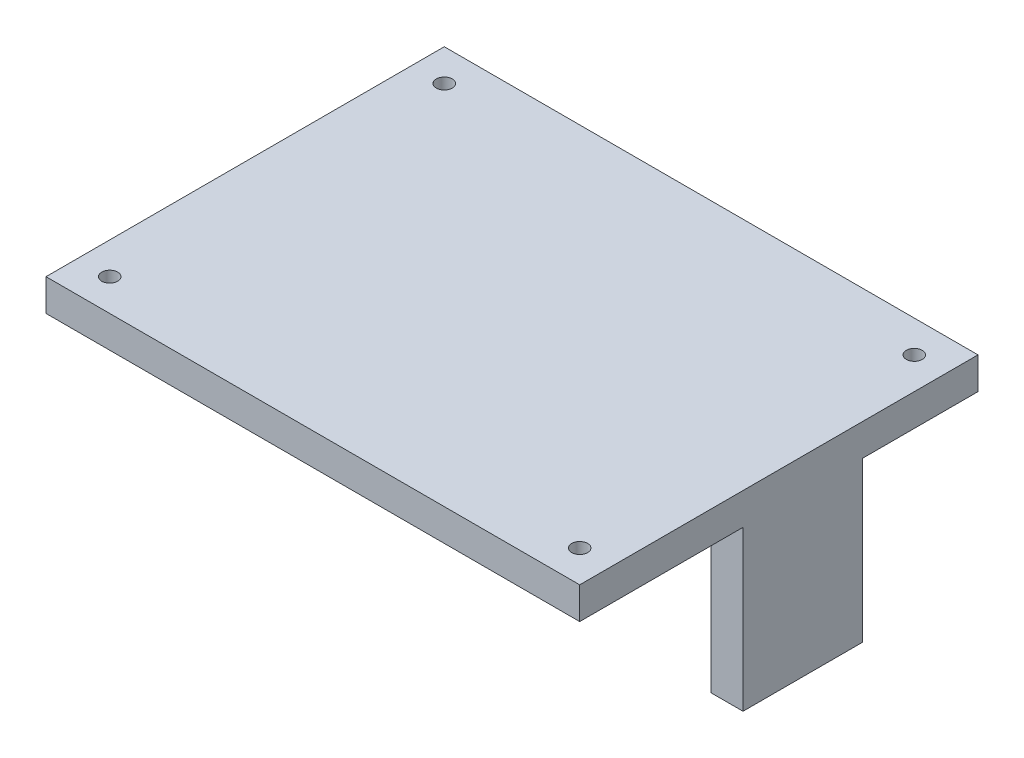
ISO-10303-21;
HEADER;
FILE_DESCRIPTION(('STEP AP214'),'2;1');
FILE_NAME('part.step','',(''),(''),'','','');
FILE_SCHEMA(('AUTOMOTIVE_DESIGN { 1 0 10303 214 1 1 1 1 }'));
ENDSEC;
DATA;
#1=APPLICATION_CONTEXT('core data for automotive mechanical design processes');
#2=APPLICATION_PROTOCOL_DEFINITION('international standard','automotive_design',2000,#1);
#3=PRODUCT_CONTEXT('',#1,'mechanical');
#4=PRODUCT('Part','Part','',(#3));
#5=PRODUCT_RELATED_PRODUCT_CATEGORY('part','',(#4));
#6=PRODUCT_DEFINITION_FORMATION('','',#4);
#7=PRODUCT_DEFINITION_CONTEXT('part definition',#1,'design');
#8=PRODUCT_DEFINITION('design','',#6,#7);
#9=PRODUCT_DEFINITION_SHAPE('','',#8);
#10=(LENGTH_UNIT() NAMED_UNIT(*) SI_UNIT(.MILLI.,.METRE.));
#11=(NAMED_UNIT(*) PLANE_ANGLE_UNIT() SI_UNIT($,.RADIAN.));
#12=(NAMED_UNIT(*) SI_UNIT($,.STERADIAN.) SOLID_ANGLE_UNIT());
#13=UNCERTAINTY_MEASURE_WITH_UNIT(LENGTH_MEASURE(1.E-05),#10,'distance_accuracy_value','');
#14=(GEOMETRIC_REPRESENTATION_CONTEXT(3) GLOBAL_UNCERTAINTY_ASSIGNED_CONTEXT((#13)) GLOBAL_UNIT_ASSIGNED_CONTEXT((#10,
#11,#12)) REPRESENTATION_CONTEXT('',''));
#15=CARTESIAN_POINT('',(0.,0.,0.));
#16=DIRECTION('',(0.,0.,1.));
#17=DIRECTION('',(1.,0.,0.));
#18=AXIS2_PLACEMENT_3D('',#15,#16,#17);
#19=CARTESIAN_POINT('',(0.,9.86878740162637,0.));
#20=DIRECTION('',(0.,1.,0.));
#21=DIRECTION('',(0.,0.,1.));
#22=AXIS2_PLACEMENT_3D('',#19,#20,#21);
#23=PLANE('',#22);
#24=CARTESIAN_POINT('',(9.24437035614937,9.86878740162637,-0.373895207510033));
#25=DIRECTION('',(0.,1.,0.));
#26=DIRECTION('',(0.,0.,1.));
#27=AXIS2_PLACEMENT_3D('',#24,#25,#26);
#28=CIRCLE('',#27,0.500000000000001);
#29=CARTESIAN_POINT('',(9.24437035614937,9.86878740162637,0.126104792489968));
#30=VERTEX_POINT('',#29);
#31=EDGE_CURVE('E147',#30,#30,#28,.F.);
#32=ORIENTED_EDGE('',*,*,#31,.F.);
#33=EDGE_LOOP('',(#32));
#34=FACE_BOUND('',#33,.T.);
#35=CARTESIAN_POINT('',(38.7443703561494,9.86878740162637,-21.37389520751));
#36=DIRECTION('',(0.,1.,0.));
#37=DIRECTION('',(0.,0.,1.));
#38=AXIS2_PLACEMENT_3D('',#35,#36,#37);
#39=CIRCLE('',#38,0.499999999999999);
#40=CARTESIAN_POINT('',(38.7443703561494,9.86878740162637,-20.87389520751));
#41=VERTEX_POINT('',#40);
#42=EDGE_CURVE('E192',#41,#41,#39,.F.);
#43=ORIENTED_EDGE('',*,*,#42,.F.);
#44=EDGE_LOOP('',(#43));
#45=FACE_BOUND('',#44,.T.);
#46=CARTESIAN_POINT('',(38.7443703561494,9.86878740162637,-0.373895207510033));
#47=DIRECTION('',(0.,1.,0.));
#48=DIRECTION('',(0.,0.,1.));
#49=AXIS2_PLACEMENT_3D('',#46,#47,#48);
#50=CIRCLE('',#49,0.499999999999999);
#51=CARTESIAN_POINT('',(38.7443703561494,9.86878740162637,0.126104792489967));
#52=VERTEX_POINT('',#51);
#53=EDGE_CURVE('E188',#52,#52,#50,.F.);
#54=ORIENTED_EDGE('',*,*,#53,.F.);
#55=EDGE_LOOP('',(#54));
#56=FACE_BOUND('',#55,.T.);
#57=CARTESIAN_POINT('',(9.24437035614937,9.86878740162637,-21.37389520751));
#58=DIRECTION('',(0.,1.,0.));
#59=DIRECTION('',(0.,0.,1.));
#60=AXIS2_PLACEMENT_3D('',#57,#58,#59);
#61=CIRCLE('',#60,0.500000000000001);
#62=CARTESIAN_POINT('',(9.24437035614937,9.86878740162637,-20.87389520751));
#63=VERTEX_POINT('',#62);
#64=EDGE_CURVE('E184',#63,#63,#61,.F.);
#65=ORIENTED_EDGE('',*,*,#64,.F.);
#66=EDGE_LOOP('',(#65));
#67=FACE_BOUND('',#66,.T.);
#68=DIRECTION('',(1.,0.,0.));
#69=VECTOR('',#68,1.);
#70=CARTESIAN_POINT('',(40.7443703561494,9.86878740162637,-16.12389520751));
#71=LINE('',#70,#69);
#72=CARTESIAN_POINT('',(38.7443703561494,9.86878740162637,-16.12389520751));
#73=VERTEX_POINT('',#72);
#74=CARTESIAN_POINT('',(40.7443703561494,9.86878740162637,-16.12389520751));
#75=VERTEX_POINT('',#74);
#76=EDGE_CURVE('E59',#73,#75,#71,.T.);
#77=ORIENTED_EDGE('',*,*,#76,.F.);
#78=DIRECTION('',(0.,0.,-1.));
#79=VECTOR('',#78,1.);
#80=CARTESIAN_POINT('',(38.7443703561494,9.86878740162637,-8.62389520751003));
#81=LINE('',#80,#79);
#82=CARTESIAN_POINT('',(38.7443703561494,9.86878740162637,-8.62389520751003));
#83=VERTEX_POINT('',#82);
#84=EDGE_CURVE('E231',#83,#73,#81,.T.);
#85=ORIENTED_EDGE('',*,*,#84,.F.);
#86=DIRECTION('',(-1.,0.,0.));
#87=VECTOR('',#86,1.);
#88=CARTESIAN_POINT('',(40.7443703561494,9.86878740162637,-8.62389520751003));
#89=LINE('',#88,#87);
#90=CARTESIAN_POINT('',(40.7443703561494,9.86878740162637,-8.62389520751003));
#91=VERTEX_POINT('',#90);
#92=EDGE_CURVE('E65',#91,#83,#89,.T.);
#93=ORIENTED_EDGE('',*,*,#92,.F.);
#94=DIRECTION('',(0.,0.,1.));
#95=VECTOR('',#94,1.);
#96=CARTESIAN_POINT('',(40.7443703561494,9.86878740162637,0.));
#97=LINE('',#96,#95);
#98=CARTESIAN_POINT('',(40.7443703561494,9.86878740162637,1.62610479248997));
#99=VERTEX_POINT('',#98);
#100=EDGE_CURVE('E131',#91,#99,#97,.T.);
#101=ORIENTED_EDGE('',*,*,#100,.T.);
#102=DIRECTION('',(1.,0.,0.));
#103=VECTOR('',#102,1.);
#104=CARTESIAN_POINT('',(0.,9.86878740162637,1.62610479248997));
#105=LINE('',#104,#103);
#106=CARTESIAN_POINT('',(7.24437035614937,9.86878740162637,1.62610479248997));
#107=VERTEX_POINT('',#106);
#108=EDGE_CURVE('E180',#107,#99,#105,.T.);
#109=ORIENTED_EDGE('',*,*,#108,.F.);
#110=DIRECTION('',(0.,0.,1.));
#111=VECTOR('',#110,1.);
#112=CARTESIAN_POINT('',(7.24437035614937,9.86878740162637,0.));
#113=LINE('',#112,#111);
#114=CARTESIAN_POINT('',(7.24437035614937,9.86878740162637,-23.37389520751));
#115=VERTEX_POINT('',#114);
#116=EDGE_CURVE('E177',#115,#107,#113,.T.);
#117=ORIENTED_EDGE('',*,*,#116,.F.);
#118=DIRECTION('',(-1.,0.,0.));
#119=VECTOR('',#118,1.);
#120=CARTESIAN_POINT('',(0.,9.86878740162637,-23.37389520751));
#121=LINE('',#120,#119);
#122=CARTESIAN_POINT('',(40.7443703561494,9.86878740162637,-23.37389520751));
#123=VERTEX_POINT('',#122);
#124=EDGE_CURVE('E174',#123,#115,#121,.T.);
#125=ORIENTED_EDGE('',*,*,#124,.F.);
#126=EDGE_CURVE('E136',#123,#75,#97,.T.);
#127=ORIENTED_EDGE('',*,*,#126,.T.);
#128=EDGE_LOOP('',(#77,#85,#93,#101,#109,#117,#125,#127));
#129=FACE_BOUND('',#128,.T.);
#130=ADVANCED_FACE('F43',(#34,#45,#56,#67,#129),#23,.F.);
#131=CARTESIAN_POINT('',(40.7443703561494,11.8687874016264,0.));
#132=DIRECTION('',(1.,0.,0.));
#133=DIRECTION('',(0.,0.,-1.));
#134=AXIS2_PLACEMENT_3D('',#131,#132,#133);
#135=PLANE('',#134);
#136=ORIENTED_EDGE('',*,*,#126,.F.);
#137=DIRECTION('',(0.,-1.,0.));
#138=VECTOR('',#137,1.);
#139=CARTESIAN_POINT('',(40.7443703561494,11.8687874016264,-23.37389520751));
#140=LINE('',#139,#138);
#141=CARTESIAN_POINT('',(40.7443703561494,11.8687874016264,-23.37389520751));
#142=VERTEX_POINT('',#141);
#143=EDGE_CURVE('E11',#142,#123,#140,.T.);
#144=ORIENTED_EDGE('',*,*,#143,.F.);
#145=DIRECTION('',(0.,0.,1.));
#146=VECTOR('',#145,1.);
#147=CARTESIAN_POINT('',(40.7443703561494,11.8687874016264,0.));
#148=LINE('',#147,#146);
#149=CARTESIAN_POINT('',(40.7443703561494,11.8687874016264,1.62610479248997));
#150=VERTEX_POINT('',#149);
#151=EDGE_CURVE('E142',#142,#150,#148,.T.);
#152=ORIENTED_EDGE('',*,*,#151,.T.);
#153=DIRECTION('',(0.,-1.,0.));
#154=VECTOR('',#153,1.);
#155=CARTESIAN_POINT('',(40.7443703561494,11.8687874016264,1.62610479248997));
#156=LINE('',#155,#154);
#157=EDGE_CURVE('E171',#150,#99,#156,.T.);
#158=ORIENTED_EDGE('',*,*,#157,.T.);
#159=ORIENTED_EDGE('',*,*,#100,.F.);
#160=DIRECTION('',(0.,1.,0.));
#161=VECTOR('',#160,1.);
#162=CARTESIAN_POINT('',(40.7443703561494,-0.131212598373632,-8.62389520751003));
#163=LINE('',#162,#161);
#164=CARTESIAN_POINT('',(40.7443703561494,-0.131212598373632,-8.62389520751003));
#165=VERTEX_POINT('',#164);
#166=EDGE_CURVE('E111',#165,#91,#163,.T.);
#167=ORIENTED_EDGE('',*,*,#166,.F.);
#168=DIRECTION('',(0.,0.,1.));
#169=VECTOR('',#168,1.);
#170=CARTESIAN_POINT('',(40.7443703561494,-0.131212598373632,-8.62389520751003));
#171=LINE('',#170,#169);
#172=CARTESIAN_POINT('',(40.7443703561494,-0.131212598373632,-16.12389520751));
#173=VERTEX_POINT('',#172);
#174=EDGE_CURVE('E118',#173,#165,#171,.T.);
#175=ORIENTED_EDGE('',*,*,#174,.F.);
#176=DIRECTION('',(0.,1.,0.));
#177=VECTOR('',#176,1.);
#178=CARTESIAN_POINT('',(40.7443703561494,-0.131212598373632,-16.12389520751));
#179=LINE('',#178,#177);
#180=EDGE_CURVE('E225',#173,#75,#179,.T.);
#181=ORIENTED_EDGE('',*,*,#180,.T.);
#182=EDGE_LOOP('',(#136,#144,#152,#158,#159,#167,#175,#181));
#183=FACE_BOUND('',#182,.T.);
#184=ADVANCED_FACE('F45',(#183),#135,.T.);
#185=CARTESIAN_POINT('',(0.,11.8687874016264,-23.37389520751));
#186=DIRECTION('',(0.,0.,1.));
#187=DIRECTION('',(1.,0.,0.));
#188=AXIS2_PLACEMENT_3D('',#185,#186,#187);
#189=PLANE('',#188);
#190=ORIENTED_EDGE('',*,*,#124,.T.);
#191=DIRECTION('',(0.,-1.,0.));
#192=VECTOR('',#191,1.);
#193=CARTESIAN_POINT('',(7.24437035614937,11.8687874016264,-23.37389520751));
#194=LINE('',#193,#192);
#195=CARTESIAN_POINT('',(7.24437035614937,11.8687874016264,-23.37389520751));
#196=VERTEX_POINT('',#195);
#197=EDGE_CURVE('E52',#196,#115,#194,.T.);
#198=ORIENTED_EDGE('',*,*,#197,.F.);
#199=DIRECTION('',(-1.,0.,0.));
#200=VECTOR('',#199,1.);
#201=CARTESIAN_POINT('',(0.,11.8687874016264,-23.37389520751));
#202=LINE('',#201,#200);
#203=EDGE_CURVE('E146',#142,#196,#202,.T.);
#204=ORIENTED_EDGE('',*,*,#203,.F.);
#205=ORIENTED_EDGE('',*,*,#143,.T.);
#206=EDGE_LOOP('',(#190,#198,#204,#205));
#207=FACE_BOUND('',#206,.T.);
#208=ADVANCED_FACE('F224',(#207),#189,.F.);
#209=CARTESIAN_POINT('',(7.24437035614937,11.8687874016264,0.));
#210=DIRECTION('',(1.,0.,0.));
#211=DIRECTION('',(0.,0.,-1.));
#212=AXIS2_PLACEMENT_3D('',#209,#210,#211);
#213=PLANE('',#212);
#214=ORIENTED_EDGE('',*,*,#116,.T.);
#215=DIRECTION('',(0.,-1.,0.));
#216=VECTOR('',#215,1.);
#217=CARTESIAN_POINT('',(7.24437035614937,11.8687874016264,1.62610479248997));
#218=LINE('',#217,#216);
#219=CARTESIAN_POINT('',(7.24437035614937,11.8687874016264,1.62610479248997));
#220=VERTEX_POINT('',#219);
#221=EDGE_CURVE('E201',#220,#107,#218,.T.);
#222=ORIENTED_EDGE('',*,*,#221,.F.);
#223=DIRECTION('',(0.,0.,1.));
#224=VECTOR('',#223,1.);
#225=CARTESIAN_POINT('',(7.24437035614937,11.8687874016264,0.));
#226=LINE('',#225,#224);
#227=EDGE_CURVE('E150',#196,#220,#226,.T.);
#228=ORIENTED_EDGE('',*,*,#227,.F.);
#229=ORIENTED_EDGE('',*,*,#197,.T.);
#230=EDGE_LOOP('',(#214,#222,#228,#229));
#231=FACE_BOUND('',#230,.T.);
#232=ADVANCED_FACE('F210',(#231),#213,.F.);
#233=CARTESIAN_POINT('',(38.7443703561494,11.8687874016264,-21.37389520751));
#234=DIRECTION('',(0.,-1.,0.));
#235=DIRECTION('',(0.,0.,-1.));
#236=AXIS2_PLACEMENT_3D('',#233,#234,#235);
#237=CYLINDRICAL_SURFACE('',#236,0.499999999999999);
#238=CARTESIAN_POINT('',(38.7443703561494,11.8687874016264,-21.37389520751));
#239=DIRECTION('',(0.,1.,0.));
#240=DIRECTION('',(0.,0.,1.));
#241=AXIS2_PLACEMENT_3D('',#238,#239,#240);
#242=CIRCLE('',#241,0.499999999999999);
#243=CARTESIAN_POINT('',(38.7443703561494,11.8687874016264,-20.87389520751));
#244=VERTEX_POINT('',#243);
#245=EDGE_CURVE('E164',#244,#244,#242,.F.);
#246=ORIENTED_EDGE('',*,*,#245,.F.);
#247=EDGE_LOOP('',(#246));
#248=FACE_BOUND('',#247,.T.);
#249=ORIENTED_EDGE('',*,*,#42,.T.);
#250=EDGE_LOOP('',(#249));
#251=FACE_BOUND('',#250,.T.);
#252=ADVANCED_FACE('F268',(#248,#251),#237,.F.);
#253=CARTESIAN_POINT('',(38.7443703561494,11.8687874016264,-0.373895207510033));
#254=DIRECTION('',(0.,-1.,0.));
#255=DIRECTION('',(0.,0.,-1.));
#256=AXIS2_PLACEMENT_3D('',#253,#254,#255);
#257=CYLINDRICAL_SURFACE('',#256,0.499999999999999);
#258=CARTESIAN_POINT('',(38.7443703561494,11.8687874016264,-0.373895207510033));
#259=DIRECTION('',(0.,1.,0.));
#260=DIRECTION('',(0.,0.,1.));
#261=AXIS2_PLACEMENT_3D('',#258,#259,#260);
#262=CIRCLE('',#261,0.499999999999999);
#263=CARTESIAN_POINT('',(38.7443703561494,11.8687874016264,0.126104792489967));
#264=VERTEX_POINT('',#263);
#265=EDGE_CURVE('E160',#264,#264,#262,.F.);
#266=ORIENTED_EDGE('',*,*,#265,.F.);
#267=EDGE_LOOP('',(#266));
#268=FACE_BOUND('',#267,.T.);
#269=ORIENTED_EDGE('',*,*,#53,.T.);
#270=EDGE_LOOP('',(#269));
#271=FACE_BOUND('',#270,.T.);
#272=ADVANCED_FACE('F271',(#268,#271),#257,.F.);
#273=CARTESIAN_POINT('',(9.24437035614937,11.8687874016264,-21.37389520751));
#274=DIRECTION('',(0.,-1.,0.));
#275=DIRECTION('',(0.,0.,-1.));
#276=AXIS2_PLACEMENT_3D('',#273,#274,#275);
#277=CYLINDRICAL_SURFACE('',#276,0.500000000000001);
#278=CARTESIAN_POINT('',(9.24437035614937,11.8687874016264,-21.37389520751));
#279=DIRECTION('',(0.,1.,0.));
#280=DIRECTION('',(0.,0.,1.));
#281=AXIS2_PLACEMENT_3D('',#278,#279,#280);
#282=CIRCLE('',#281,0.500000000000001);
#283=CARTESIAN_POINT('',(9.24437035614937,11.8687874016264,-20.87389520751));
#284=VERTEX_POINT('',#283);
#285=EDGE_CURVE('E156',#284,#284,#282,.F.);
#286=ORIENTED_EDGE('',*,*,#285,.F.);
#287=EDGE_LOOP('',(#286));
#288=FACE_BOUND('',#287,.T.);
#289=ORIENTED_EDGE('',*,*,#64,.T.);
#290=EDGE_LOOP('',(#289));
#291=FACE_BOUND('',#290,.T.);
#292=ADVANCED_FACE('F275',(#288,#291),#277,.F.);
#293=CARTESIAN_POINT('',(0.,11.8687874016264,1.62610479248997));
#294=DIRECTION('',(0.,0.,-1.));
#295=DIRECTION('',(-1.,0.,0.));
#296=AXIS2_PLACEMENT_3D('',#293,#294,#295);
#297=PLANE('',#296);
#298=ORIENTED_EDGE('',*,*,#108,.T.);
#299=ORIENTED_EDGE('',*,*,#157,.F.);
#300=DIRECTION('',(1.,0.,0.));
#301=VECTOR('',#300,1.);
#302=CARTESIAN_POINT('',(0.,11.8687874016264,1.62610479248997));
#303=LINE('',#302,#301);
#304=EDGE_CURVE('E153',#220,#150,#303,.T.);
#305=ORIENTED_EDGE('',*,*,#304,.F.);
#306=ORIENTED_EDGE('',*,*,#221,.T.);
#307=EDGE_LOOP('',(#298,#299,#305,#306));
#308=FACE_BOUND('',#307,.T.);
#309=ADVANCED_FACE('F218',(#308),#297,.F.);
#310=CARTESIAN_POINT('',(9.24437035614937,11.8687874016264,-0.373895207510033));
#311=DIRECTION('',(0.,-1.,0.));
#312=DIRECTION('',(0.,0.,-1.));
#313=AXIS2_PLACEMENT_3D('',#310,#311,#312);
#314=CYLINDRICAL_SURFACE('',#313,0.500000000000001);
#315=CARTESIAN_POINT('',(9.24437035614937,11.8687874016264,-0.373895207510033));
#316=DIRECTION('',(0.,1.,0.));
#317=DIRECTION('',(0.,0.,1.));
#318=AXIS2_PLACEMENT_3D('',#315,#316,#317);
#319=CIRCLE('',#318,0.500000000000001);
#320=CARTESIAN_POINT('',(9.24437035614937,11.8687874016264,0.126104792489968));
#321=VERTEX_POINT('',#320);
#322=EDGE_CURVE('E168',#321,#321,#319,.F.);
#323=ORIENTED_EDGE('',*,*,#322,.F.);
#324=EDGE_LOOP('',(#323));
#325=FACE_BOUND('',#324,.T.);
#326=ORIENTED_EDGE('',*,*,#31,.T.);
#327=EDGE_LOOP('',(#326));
#328=FACE_BOUND('',#327,.T.);
#329=ADVANCED_FACE('F264',(#325,#328),#314,.F.);
#330=CARTESIAN_POINT('',(0.,11.8687874016264,0.));
#331=DIRECTION('',(0.,1.,0.));
#332=DIRECTION('',(0.,0.,1.));
#333=AXIS2_PLACEMENT_3D('',#330,#331,#332);
#334=PLANE('',#333);
#335=ORIENTED_EDGE('',*,*,#151,.F.);
#336=ORIENTED_EDGE('',*,*,#203,.T.);
#337=ORIENTED_EDGE('',*,*,#227,.T.);
#338=ORIENTED_EDGE('',*,*,#304,.T.);
#339=EDGE_LOOP('',(#335,#336,#337,#338));
#340=FACE_BOUND('',#339,.T.);
#341=ORIENTED_EDGE('',*,*,#285,.T.);
#342=EDGE_LOOP('',(#341));
#343=FACE_BOUND('',#342,.T.);
#344=ORIENTED_EDGE('',*,*,#265,.T.);
#345=EDGE_LOOP('',(#344));
#346=FACE_BOUND('',#345,.T.);
#347=ORIENTED_EDGE('',*,*,#245,.T.);
#348=EDGE_LOOP('',(#347));
#349=FACE_BOUND('',#348,.T.);
#350=ORIENTED_EDGE('',*,*,#322,.T.);
#351=EDGE_LOOP('',(#350));
#352=FACE_BOUND('',#351,.T.);
#353=ADVANCED_FACE('F222',(#340,#343,#346,#349,#352),#334,.T.);
#354=CARTESIAN_POINT('',(40.7443703561494,-0.131212598373632,-8.62389520751003));
#355=DIRECTION('',(0.,0.,-1.));
#356=DIRECTION('',(-1.,0.,0.));
#357=AXIS2_PLACEMENT_3D('',#354,#355,#356);
#358=PLANE('',#357);
#359=ORIENTED_EDGE('',*,*,#92,.T.);
#360=DIRECTION('',(0.,1.,0.));
#361=VECTOR('',#360,1.);
#362=CARTESIAN_POINT('',(38.7443703561494,-0.131212598373632,-8.62389520751003));
#363=LINE('',#362,#361);
#364=CARTESIAN_POINT('',(38.7443703561494,-0.131212598373632,-8.62389520751003));
#365=VERTEX_POINT('',#364);
#366=EDGE_CURVE('E113',#365,#83,#363,.T.);
#367=ORIENTED_EDGE('',*,*,#366,.F.);
#368=DIRECTION('',(-1.,0.,0.));
#369=VECTOR('',#368,1.);
#370=CARTESIAN_POINT('',(40.7443703561494,-0.131212598373632,-8.62389520751003));
#371=LINE('',#370,#369);
#372=EDGE_CURVE('E107',#165,#365,#371,.T.);
#373=ORIENTED_EDGE('',*,*,#372,.F.);
#374=ORIENTED_EDGE('',*,*,#166,.T.);
#375=EDGE_LOOP('',(#359,#367,#373,#374));
#376=FACE_BOUND('',#375,.T.);
#377=ADVANCED_FACE('F109',(#376),#358,.F.);
#378=CARTESIAN_POINT('',(38.7443703561494,-0.131212598373632,-8.62389520751003));
#379=DIRECTION('',(1.,0.,0.));
#380=DIRECTION('',(0.,0.,-1.));
#381=AXIS2_PLACEMENT_3D('',#378,#379,#380);
#382=PLANE('',#381);
#383=ORIENTED_EDGE('',*,*,#84,.T.);
#384=DIRECTION('',(0.,1.,0.));
#385=VECTOR('',#384,1.);
#386=CARTESIAN_POINT('',(38.7443703561494,-0.131212598373632,-16.12389520751));
#387=LINE('',#386,#385);
#388=CARTESIAN_POINT('',(38.7443703561494,-0.131212598373632,-16.12389520751));
#389=VERTEX_POINT('',#388);
#390=EDGE_CURVE('E138',#389,#73,#387,.T.);
#391=ORIENTED_EDGE('',*,*,#390,.F.);
#392=DIRECTION('',(0.,0.,-1.));
#393=VECTOR('',#392,1.);
#394=CARTESIAN_POINT('',(38.7443703561494,-0.131212598373632,-8.62389520751003));
#395=LINE('',#394,#393);
#396=EDGE_CURVE('E117',#365,#389,#395,.T.);
#397=ORIENTED_EDGE('',*,*,#396,.F.);
#398=ORIENTED_EDGE('',*,*,#366,.T.);
#399=EDGE_LOOP('',(#383,#391,#397,#398));
#400=FACE_BOUND('',#399,.T.);
#401=ADVANCED_FACE('F245',(#400),#382,.F.);
#402=CARTESIAN_POINT('',(40.7443703561494,-0.131212598373632,-16.12389520751));
#403=DIRECTION('',(0.,0.,1.));
#404=DIRECTION('',(1.,0.,0.));
#405=AXIS2_PLACEMENT_3D('',#402,#403,#404);
#406=PLANE('',#405);
#407=ORIENTED_EDGE('',*,*,#76,.T.);
#408=ORIENTED_EDGE('',*,*,#180,.F.);
#409=DIRECTION('',(1.,0.,0.));
#410=VECTOR('',#409,1.);
#411=CARTESIAN_POINT('',(40.7443703561494,-0.131212598373632,-16.12389520751));
#412=LINE('',#411,#410);
#413=EDGE_CURVE('E123',#389,#173,#412,.T.);
#414=ORIENTED_EDGE('',*,*,#413,.F.);
#415=ORIENTED_EDGE('',*,*,#390,.T.);
#416=EDGE_LOOP('',(#407,#408,#414,#415));
#417=FACE_BOUND('',#416,.T.);
#418=ADVANCED_FACE('F228',(#417),#406,.F.);
#419=CARTESIAN_POINT('',(0.,-0.131212598373632,0.));
#420=DIRECTION('',(0.,1.,0.));
#421=DIRECTION('',(0.,0.,1.));
#422=AXIS2_PLACEMENT_3D('',#419,#420,#421);
#423=PLANE('',#422);
#424=ORIENTED_EDGE('',*,*,#174,.T.);
#425=ORIENTED_EDGE('',*,*,#372,.T.);
#426=ORIENTED_EDGE('',*,*,#396,.T.);
#427=ORIENTED_EDGE('',*,*,#413,.T.);
#428=EDGE_LOOP('',(#424,#425,#426,#427));
#429=FACE_BOUND('',#428,.T.);
#430=ADVANCED_FACE('F121',(#429),#423,.F.);
#431=CLOSED_SHELL('',(#130,#184,#208,#232,#252,#272,#292,#309,#329,#353,#377,#401,#418,#430));
#432=MANIFOLD_SOLID_BREP('B2',#431);
#433=ADVANCED_BREP_SHAPE_REPRESENTATION('',(#18,#432),#14);
#434=SHAPE_DEFINITION_REPRESENTATION(#9,#433);
ENDSEC;
END-ISO-10303-21;
